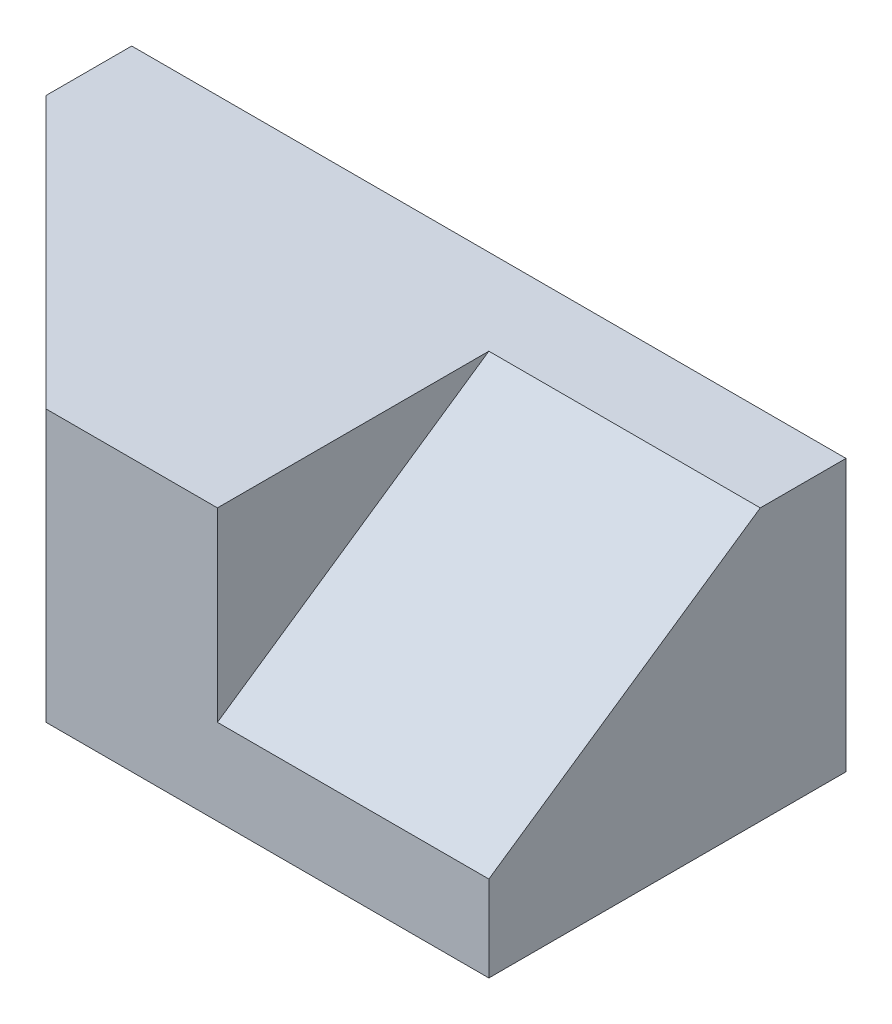
ISO-10303-21;
HEADER;
FILE_DESCRIPTION(('STEP AP214'),'2;1');
FILE_NAME('part.step','',(''),(''),'','','');
FILE_SCHEMA(('AUTOMOTIVE_DESIGN { 1 0 10303 214 1 1 1 1 }'));
ENDSEC;
DATA;
#1=APPLICATION_CONTEXT('core data for automotive mechanical design processes');
#2=APPLICATION_PROTOCOL_DEFINITION('international standard','automotive_design',2000,#1);
#3=PRODUCT_CONTEXT('',#1,'mechanical');
#4=PRODUCT('Part','Part','',(#3));
#5=PRODUCT_RELATED_PRODUCT_CATEGORY('part','',(#4));
#6=PRODUCT_DEFINITION_FORMATION('','',#4);
#7=PRODUCT_DEFINITION_CONTEXT('part definition',#1,'design');
#8=PRODUCT_DEFINITION('design','',#6,#7);
#9=PRODUCT_DEFINITION_SHAPE('','',#8);
#10=(LENGTH_UNIT() NAMED_UNIT(*) SI_UNIT(.MILLI.,.METRE.));
#11=(NAMED_UNIT(*) PLANE_ANGLE_UNIT() SI_UNIT($,.RADIAN.));
#12=(NAMED_UNIT(*) SI_UNIT($,.STERADIAN.) SOLID_ANGLE_UNIT());
#13=UNCERTAINTY_MEASURE_WITH_UNIT(LENGTH_MEASURE(1.E-05),#10,'distance_accuracy_value','');
#14=(GEOMETRIC_REPRESENTATION_CONTEXT(3) GLOBAL_UNCERTAINTY_ASSIGNED_CONTEXT((#13)) GLOBAL_UNIT_ASSIGNED_CONTEXT((#10,
#11,#12)) REPRESENTATION_CONTEXT('',''));
#15=CARTESIAN_POINT('',(0.,0.,0.));
#16=DIRECTION('',(0.,0.,1.));
#17=DIRECTION('',(1.,0.,0.));
#18=AXIS2_PLACEMENT_3D('',#15,#16,#17);
#19=CARTESIAN_POINT('',(100.,38.,0.));
#20=DIRECTION('',(0.,0.,1.));
#21=DIRECTION('',(1.,0.,0.));
#22=AXIS2_PLACEMENT_3D('',#19,#20,#21);
#23=PLANE('',#22);
#24=DIRECTION('',(-1.,0.,0.));
#25=VECTOR('',#24,1.);
#26=CARTESIAN_POINT('',(100.,0.,0.));
#27=LINE('',#26,#25);
#28=CARTESIAN_POINT('',(100.,0.,0.));
#29=VERTEX_POINT('',#28);
#30=CARTESIAN_POINT('',(0.,0.,0.));
#31=VERTEX_POINT('',#30);
#32=EDGE_CURVE('E140',#29,#31,#27,.T.);
#33=ORIENTED_EDGE('',*,*,#32,.T.);
#34=DIRECTION('',(0.,-1.,0.));
#35=VECTOR('',#34,1.);
#36=CARTESIAN_POINT('',(0.,38.,0.));
#37=LINE('',#36,#35);
#38=CARTESIAN_POINT('',(0.,38.,0.));
#39=VERTEX_POINT('',#38);
#40=EDGE_CURVE('E11',#39,#31,#37,.T.);
#41=ORIENTED_EDGE('',*,*,#40,.F.);
#42=DIRECTION('',(-1.,0.,0.));
#43=VECTOR('',#42,1.);
#44=CARTESIAN_POINT('',(100.,38.,0.));
#45=LINE('',#44,#43);
#46=CARTESIAN_POINT('',(100.,38.,0.));
#47=VERTEX_POINT('',#46);
#48=EDGE_CURVE('E157',#47,#39,#45,.T.);
#49=ORIENTED_EDGE('',*,*,#48,.F.);
#50=DIRECTION('',(0.,-1.,0.));
#51=VECTOR('',#50,1.);
#52=CARTESIAN_POINT('',(100.,38.,0.));
#53=LINE('',#52,#51);
#54=EDGE_CURVE('E135',#47,#29,#53,.T.);
#55=ORIENTED_EDGE('',*,*,#54,.T.);
#56=EDGE_LOOP('',(#33,#41,#49,#55));
#57=FACE_BOUND('',#56,.T.);
#58=ADVANCED_FACE('F43',(#57),#23,.F.);
#59=CARTESIAN_POINT('',(0.,38.,0.));
#60=DIRECTION('',(1.,0.,0.));
#61=DIRECTION('',(0.,0.,-1.));
#62=AXIS2_PLACEMENT_3D('',#59,#60,#61);
#63=PLANE('',#62);
#64=DIRECTION('',(0.,0.,1.));
#65=VECTOR('',#64,1.);
#66=CARTESIAN_POINT('',(0.,0.,0.));
#67=LINE('',#66,#65);
#68=CARTESIAN_POINT('',(0.,0.,12.));
#69=VERTEX_POINT('',#68);
#70=EDGE_CURVE('E144',#31,#69,#67,.T.);
#71=ORIENTED_EDGE('',*,*,#70,.T.);
#72=DIRECTION('',(0.,-1.,0.));
#73=VECTOR('',#72,1.);
#74=CARTESIAN_POINT('',(0.,38.,12.));
#75=LINE('',#74,#73);
#76=CARTESIAN_POINT('',(0.,38.,12.));
#77=VERTEX_POINT('',#76);
#78=EDGE_CURVE('E51',#77,#69,#75,.T.);
#79=ORIENTED_EDGE('',*,*,#78,.F.);
#80=DIRECTION('',(0.,0.,1.));
#81=VECTOR('',#80,1.);
#82=CARTESIAN_POINT('',(0.,38.,0.));
#83=LINE('',#82,#81);
#84=EDGE_CURVE('E98',#39,#77,#83,.T.);
#85=ORIENTED_EDGE('',*,*,#84,.F.);
#86=ORIENTED_EDGE('',*,*,#40,.T.);
#87=EDGE_LOOP('',(#71,#79,#85,#86));
#88=FACE_BOUND('',#87,.T.);
#89=ADVANCED_FACE('F190',(#88),#63,.F.);
#90=CARTESIAN_POINT('',(0.,38.,12.));
#91=DIRECTION('',(0.707106781186548,0.,-0.707106781186548));
#92=DIRECTION('',(-0.707106781186548,0.,-0.707106781186548));
#93=AXIS2_PLACEMENT_3D('',#90,#91,#92);
#94=PLANE('',#93);
#95=DIRECTION('',(0.707106781186547,0.,0.707106781186547));
#96=VECTOR('',#95,1.);
#97=CARTESIAN_POINT('',(0.,0.,12.));
#98=LINE('',#97,#96);
#99=CARTESIAN_POINT('',(38.,0.,50.));
#100=VERTEX_POINT('',#99);
#101=EDGE_CURVE('E148',#69,#100,#98,.T.);
#102=ORIENTED_EDGE('',*,*,#101,.T.);
#103=DIRECTION('',(0.,-1.,0.));
#104=VECTOR('',#103,1.);
#105=CARTESIAN_POINT('',(38.,38.,50.));
#106=LINE('',#105,#104);
#107=CARTESIAN_POINT('',(38.,38.,50.));
#108=VERTEX_POINT('',#107);
#109=EDGE_CURVE('E163',#108,#100,#106,.T.);
#110=ORIENTED_EDGE('',*,*,#109,.F.);
#111=DIRECTION('',(0.707106781186547,0.,0.707106781186547));
#112=VECTOR('',#111,1.);
#113=CARTESIAN_POINT('',(0.,38.,12.));
#114=LINE('',#113,#112);
#115=EDGE_CURVE('E129',#77,#108,#114,.T.);
#116=ORIENTED_EDGE('',*,*,#115,.F.);
#117=ORIENTED_EDGE('',*,*,#78,.T.);
#118=EDGE_LOOP('',(#102,#110,#116,#117));
#119=FACE_BOUND('',#118,.T.);
#120=ADVANCED_FACE('F169',(#119),#94,.F.);
#121=CARTESIAN_POINT('',(38.,38.,50.));
#122=DIRECTION('',(0.,0.,-1.));
#123=DIRECTION('',(-1.,0.,0.));
#124=AXIS2_PLACEMENT_3D('',#121,#122,#123);
#125=PLANE('',#124);
#126=DIRECTION('',(0.,-1.,0.));
#127=VECTOR('',#126,1.);
#128=CARTESIAN_POINT('',(100.,38.,50.));
#129=LINE('',#128,#127);
#130=CARTESIAN_POINT('',(100.,12.,50.));
#131=VERTEX_POINT('',#130);
#132=CARTESIAN_POINT('',(100.,0.,50.));
#133=VERTEX_POINT('',#132);
#134=EDGE_CURVE('E160',#131,#133,#129,.T.);
#135=ORIENTED_EDGE('',*,*,#134,.F.);
#136=DIRECTION('',(1.,0.,0.));
#137=VECTOR('',#136,1.);
#138=CARTESIAN_POINT('',(62.,12.,50.));
#139=LINE('',#138,#137);
#140=CARTESIAN_POINT('',(62.,12.,50.));
#141=VERTEX_POINT('',#140);
#142=EDGE_CURVE('E124',#141,#131,#139,.T.);
#143=ORIENTED_EDGE('',*,*,#142,.F.);
#144=DIRECTION('',(0.,-1.,0.));
#145=VECTOR('',#144,1.);
#146=CARTESIAN_POINT('',(62.,12.,50.));
#147=LINE('',#146,#145);
#148=CARTESIAN_POINT('',(62.,38.,50.));
#149=VERTEX_POINT('',#148);
#150=EDGE_CURVE('E112',#149,#141,#147,.T.);
#151=ORIENTED_EDGE('',*,*,#150,.F.);
#152=DIRECTION('',(1.,0.,0.));
#153=VECTOR('',#152,1.);
#154=CARTESIAN_POINT('',(38.,38.,50.));
#155=LINE('',#154,#153);
#156=EDGE_CURVE('E123',#108,#149,#155,.T.);
#157=ORIENTED_EDGE('',*,*,#156,.F.);
#158=ORIENTED_EDGE('',*,*,#109,.T.);
#159=DIRECTION('',(1.,0.,0.));
#160=VECTOR('',#159,1.);
#161=CARTESIAN_POINT('',(38.,0.,50.));
#162=LINE('',#161,#160);
#163=EDGE_CURVE('E151',#100,#133,#162,.T.);
#164=ORIENTED_EDGE('',*,*,#163,.T.);
#165=EDGE_LOOP('',(#135,#143,#151,#157,#158,#164));
#166=FACE_BOUND('',#165,.T.);
#167=ADVANCED_FACE('F121',(#166),#125,.F.);
#168=CARTESIAN_POINT('',(100.,38.,50.));
#169=DIRECTION('',(-1.,0.,0.));
#170=DIRECTION('',(0.,0.,1.));
#171=AXIS2_PLACEMENT_3D('',#168,#169,#170);
#172=PLANE('',#171);
#173=DIRECTION('',(0.,0.,-1.));
#174=VECTOR('',#173,1.);
#175=CARTESIAN_POINT('',(100.,38.,50.));
#176=LINE('',#175,#174);
#177=CARTESIAN_POINT('',(100.,38.,12.));
#178=VERTEX_POINT('',#177);
#179=EDGE_CURVE('E67',#178,#47,#176,.T.);
#180=ORIENTED_EDGE('',*,*,#179,.F.);
#181=DIRECTION('',(0.,0.56468391559199,-0.825307261249832));
#182=VECTOR('',#181,1.);
#183=CARTESIAN_POINT('',(100.,38.,12.));
#184=LINE('',#183,#182);
#185=EDGE_CURVE('E115',#131,#178,#184,.T.);
#186=ORIENTED_EDGE('',*,*,#185,.F.);
#187=ORIENTED_EDGE('',*,*,#134,.T.);
#188=DIRECTION('',(0.,0.,-1.));
#189=VECTOR('',#188,1.);
#190=CARTESIAN_POINT('',(100.,0.,50.));
#191=LINE('',#190,#189);
#192=EDGE_CURVE('E91',#133,#29,#191,.T.);
#193=ORIENTED_EDGE('',*,*,#192,.T.);
#194=ORIENTED_EDGE('',*,*,#54,.F.);
#195=EDGE_LOOP('',(#180,#186,#187,#193,#194));
#196=FACE_BOUND('',#195,.T.);
#197=ADVANCED_FACE('F175',(#196),#172,.F.);
#198=CARTESIAN_POINT('',(0.,38.,0.));
#199=DIRECTION('',(0.,1.,0.));
#200=DIRECTION('',(0.,0.,1.));
#201=AXIS2_PLACEMENT_3D('',#198,#199,#200);
#202=PLANE('',#201);
#203=DIRECTION('',(1.,0.,0.));
#204=VECTOR('',#203,1.);
#205=CARTESIAN_POINT('',(62.,38.,12.));
#206=LINE('',#205,#204);
#207=CARTESIAN_POINT('',(62.,38.,12.));
#208=VERTEX_POINT('',#207);
#209=EDGE_CURVE('E145',#208,#178,#206,.T.);
#210=ORIENTED_EDGE('',*,*,#209,.T.);
#211=ORIENTED_EDGE('',*,*,#179,.T.);
#212=ORIENTED_EDGE('',*,*,#48,.T.);
#213=ORIENTED_EDGE('',*,*,#84,.T.);
#214=ORIENTED_EDGE('',*,*,#115,.T.);
#215=ORIENTED_EDGE('',*,*,#156,.T.);
#216=DIRECTION('',(0.,0.,1.));
#217=VECTOR('',#216,1.);
#218=CARTESIAN_POINT('',(62.,38.,50.));
#219=LINE('',#218,#217);
#220=EDGE_CURVE('E109',#208,#149,#219,.T.);
#221=ORIENTED_EDGE('',*,*,#220,.F.);
#222=EDGE_LOOP('',(#210,#211,#212,#213,#214,#215,#221));
#223=FACE_BOUND('',#222,.T.);
#224=ADVANCED_FACE('F127',(#223),#202,.T.);
#225=CARTESIAN_POINT('',(0.,0.,0.));
#226=DIRECTION('',(0.,1.,0.));
#227=DIRECTION('',(0.,0.,1.));
#228=AXIS2_PLACEMENT_3D('',#225,#226,#227);
#229=PLANE('',#228);
#230=ORIENTED_EDGE('',*,*,#32,.F.);
#231=ORIENTED_EDGE('',*,*,#192,.F.);
#232=ORIENTED_EDGE('',*,*,#163,.F.);
#233=ORIENTED_EDGE('',*,*,#101,.F.);
#234=ORIENTED_EDGE('',*,*,#70,.F.);
#235=EDGE_LOOP('',(#230,#231,#232,#233,#234));
#236=FACE_BOUND('',#235,.T.);
#237=ADVANCED_FACE('F173',(#236),#229,.F.);
#238=CARTESIAN_POINT('',(62.,38.,12.));
#239=DIRECTION('',(0.,-0.825307261249832,-0.56468391559199));
#240=DIRECTION('',(0.,0.56468391559199,-0.825307261249832));
#241=AXIS2_PLACEMENT_3D('',#238,#239,#240);
#242=PLANE('',#241);
#243=ORIENTED_EDGE('',*,*,#185,.T.);
#244=ORIENTED_EDGE('',*,*,#209,.F.);
#245=DIRECTION('',(0.,0.56468391559199,-0.825307261249832));
#246=VECTOR('',#245,1.);
#247=CARTESIAN_POINT('',(62.,38.,12.));
#248=LINE('',#247,#246);
#249=EDGE_CURVE('E58',#141,#208,#248,.T.);
#250=ORIENTED_EDGE('',*,*,#249,.F.);
#251=ORIENTED_EDGE('',*,*,#142,.T.);
#252=EDGE_LOOP('',(#243,#244,#250,#251));
#253=FACE_BOUND('',#252,.T.);
#254=ADVANCED_FACE('F204',(#253),#242,.F.);
#255=CARTESIAN_POINT('',(62.,0.,0.));
#256=DIRECTION('',(1.,0.,0.));
#257=DIRECTION('',(0.,0.,-1.));
#258=AXIS2_PLACEMENT_3D('',#255,#256,#257);
#259=PLANE('',#258);
#260=ORIENTED_EDGE('',*,*,#220,.T.);
#261=ORIENTED_EDGE('',*,*,#150,.T.);
#262=ORIENTED_EDGE('',*,*,#249,.T.);
#263=EDGE_LOOP('',(#260,#261,#262));
#264=FACE_BOUND('',#263,.T.);
#265=ADVANCED_FACE('F111',(#264),#259,.T.);
#266=CLOSED_SHELL('',(#58,#89,#120,#167,#197,#224,#237,#254,#265));
#267=MANIFOLD_SOLID_BREP('B2',#266);
#268=ADVANCED_BREP_SHAPE_REPRESENTATION('',(#18,#267),#14);
#269=SHAPE_DEFINITION_REPRESENTATION(#9,#268);
ENDSEC;
END-ISO-10303-21;
